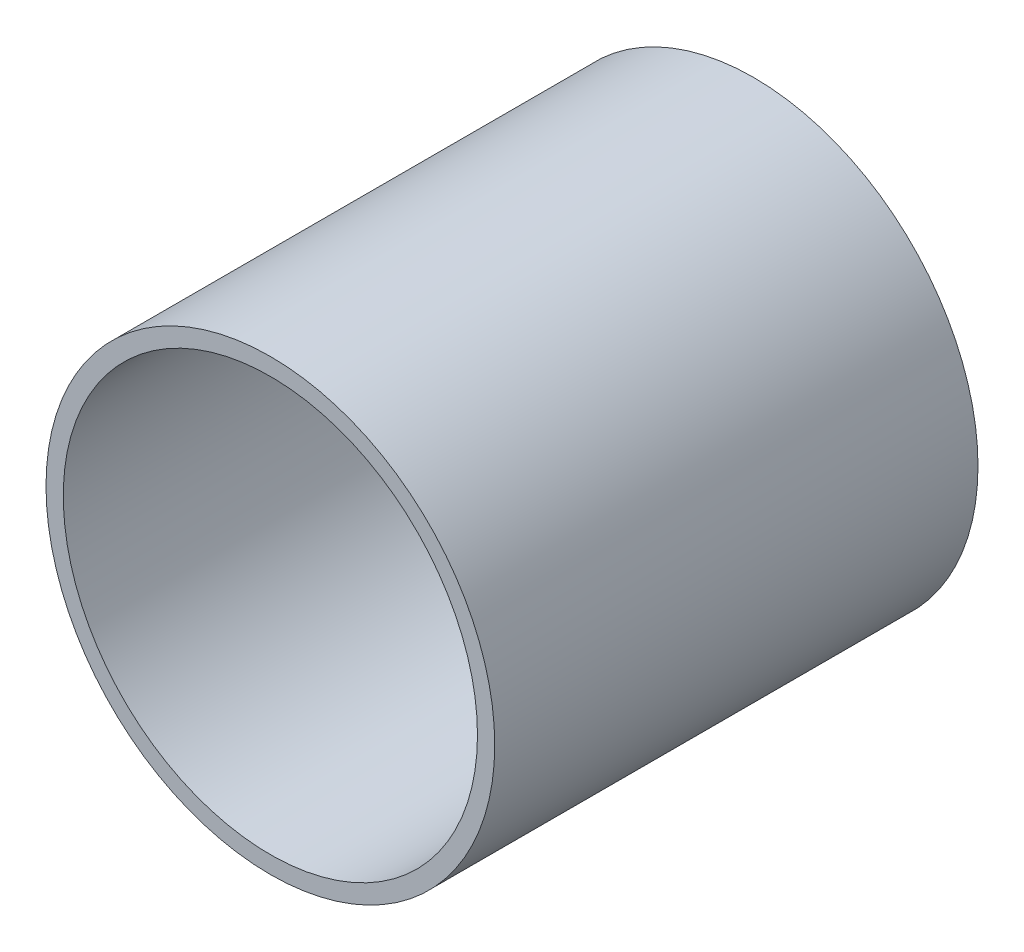
ISO-10303-21;
HEADER;
FILE_DESCRIPTION(('STEP AP214'),'2;1');
FILE_NAME('part.step','',(''),(''),'','','');
FILE_SCHEMA(('AUTOMOTIVE_DESIGN { 1 0 10303 214 1 1 1 1 }'));
ENDSEC;
DATA;
#1=APPLICATION_CONTEXT('core data for automotive mechanical design processes');
#2=APPLICATION_PROTOCOL_DEFINITION('international standard','automotive_design',2000,#1);
#3=PRODUCT_CONTEXT('',#1,'mechanical');
#4=PRODUCT('Part','Part','',(#3));
#5=PRODUCT_RELATED_PRODUCT_CATEGORY('part','',(#4));
#6=PRODUCT_DEFINITION_FORMATION('','',#4);
#7=PRODUCT_DEFINITION_CONTEXT('part definition',#1,'design');
#8=PRODUCT_DEFINITION('design','',#6,#7);
#9=PRODUCT_DEFINITION_SHAPE('','',#8);
#10=(LENGTH_UNIT() NAMED_UNIT(*) SI_UNIT(.MILLI.,.METRE.));
#11=(NAMED_UNIT(*) PLANE_ANGLE_UNIT() SI_UNIT($,.RADIAN.));
#12=(NAMED_UNIT(*) SI_UNIT($,.STERADIAN.) SOLID_ANGLE_UNIT());
#13=UNCERTAINTY_MEASURE_WITH_UNIT(LENGTH_MEASURE(1.E-05),#10,'distance_accuracy_value','');
#14=(GEOMETRIC_REPRESENTATION_CONTEXT(3) GLOBAL_UNCERTAINTY_ASSIGNED_CONTEXT((#13)) GLOBAL_UNIT_ASSIGNED_CONTEXT((#10,
#11,#12)) REPRESENTATION_CONTEXT('',''));
#15=CARTESIAN_POINT('',(0.,0.,0.));
#16=DIRECTION('',(0.,0.,1.));
#17=DIRECTION('',(1.,0.,0.));
#18=AXIS2_PLACEMENT_3D('',#15,#16,#17);
#19=CARTESIAN_POINT('',(0.,0.,70.));
#20=DIRECTION('',(0.,0.,1.));
#21=DIRECTION('',(1.,0.,0.));
#22=AXIS2_PLACEMENT_3D('',#19,#20,#21);
#23=PLANE('',#22);
#24=CARTESIAN_POINT('',(0.,0.,70.));
#25=DIRECTION('',(0.,0.,1.));
#26=DIRECTION('',(1.,0.,0.));
#27=AXIS2_PLACEMENT_3D('',#24,#25,#26);
#28=CIRCLE('',#27,32.5);
#29=CARTESIAN_POINT('',(32.5,0.,70.));
#30=VERTEX_POINT('',#29);
#31=EDGE_CURVE('E10',#30,#30,#28,.T.);
#32=ORIENTED_EDGE('',*,*,#31,.T.);
#33=EDGE_LOOP('',(#32));
#34=FACE_BOUND('',#33,.T.);
#35=CARTESIAN_POINT('',(0.,0.,70.));
#36=DIRECTION('',(0.,0.,1.));
#37=DIRECTION('',(1.,0.,0.));
#38=AXIS2_PLACEMENT_3D('',#35,#36,#37);
#39=CIRCLE('',#38,30.);
#40=CARTESIAN_POINT('',(30.,0.,70.));
#41=VERTEX_POINT('',#40);
#42=EDGE_CURVE('E46',#41,#41,#39,.T.);
#43=ORIENTED_EDGE('',*,*,#42,.F.);
#44=EDGE_LOOP('',(#43));
#45=FACE_BOUND('',#44,.T.);
#46=ADVANCED_FACE('F35',(#34,#45),#23,.T.);
#47=CARTESIAN_POINT('',(0.,0.,0.));
#48=DIRECTION('',(0.,0.,1.));
#49=DIRECTION('',(1.,0.,0.));
#50=AXIS2_PLACEMENT_3D('',#47,#48,#49);
#51=PLANE('',#50);
#52=CARTESIAN_POINT('',(0.,0.,0.));
#53=DIRECTION('',(0.,0.,1.));
#54=DIRECTION('',(1.,0.,0.));
#55=AXIS2_PLACEMENT_3D('',#52,#53,#54);
#56=CIRCLE('',#55,32.5);
#57=CARTESIAN_POINT('',(32.5,0.,0.));
#58=VERTEX_POINT('',#57);
#59=EDGE_CURVE('E39',#58,#58,#56,.T.);
#60=ORIENTED_EDGE('',*,*,#59,.F.);
#61=EDGE_LOOP('',(#60));
#62=FACE_BOUND('',#61,.T.);
#63=CARTESIAN_POINT('',(0.,0.,0.));
#64=DIRECTION('',(0.,0.,1.));
#65=DIRECTION('',(1.,0.,0.));
#66=AXIS2_PLACEMENT_3D('',#63,#64,#65);
#67=CIRCLE('',#66,30.);
#68=CARTESIAN_POINT('',(30.,0.,0.));
#69=VERTEX_POINT('',#68);
#70=EDGE_CURVE('E48',#69,#69,#67,.T.);
#71=ORIENTED_EDGE('',*,*,#70,.T.);
#72=EDGE_LOOP('',(#71));
#73=FACE_BOUND('',#72,.T.);
#74=ADVANCED_FACE('F58',(#62,#73),#51,.F.);
#75=CARTESIAN_POINT('',(0.,0.,70.));
#76=DIRECTION('',(0.,0.,-1.));
#77=DIRECTION('',(-1.,0.,0.));
#78=AXIS2_PLACEMENT_3D('',#75,#76,#77);
#79=CYLINDRICAL_SURFACE('',#78,32.5);
#80=ORIENTED_EDGE('',*,*,#31,.F.);
#81=EDGE_LOOP('',(#80));
#82=FACE_BOUND('',#81,.T.);
#83=ORIENTED_EDGE('',*,*,#59,.T.);
#84=EDGE_LOOP('',(#83));
#85=FACE_BOUND('',#84,.T.);
#86=ADVANCED_FACE('F37',(#82,#85),#79,.T.);
#87=CARTESIAN_POINT('',(0.,0.,70.));
#88=DIRECTION('',(0.,0.,-1.));
#89=DIRECTION('',(-1.,0.,0.));
#90=AXIS2_PLACEMENT_3D('',#87,#88,#89);
#91=CYLINDRICAL_SURFACE('',#90,30.);
#92=ORIENTED_EDGE('',*,*,#42,.T.);
#93=EDGE_LOOP('',(#92));
#94=FACE_BOUND('',#93,.T.);
#95=ORIENTED_EDGE('',*,*,#70,.F.);
#96=EDGE_LOOP('',(#95));
#97=FACE_BOUND('',#96,.T.);
#98=ADVANCED_FACE('F54',(#94,#97),#91,.F.);
#99=CLOSED_SHELL('',(#46,#74,#86,#98));
#100=MANIFOLD_SOLID_BREP('B2',#99);
#101=ADVANCED_BREP_SHAPE_REPRESENTATION('',(#18,#100),#14);
#102=SHAPE_DEFINITION_REPRESENTATION(#9,#101);
ENDSEC;
END-ISO-10303-21;
